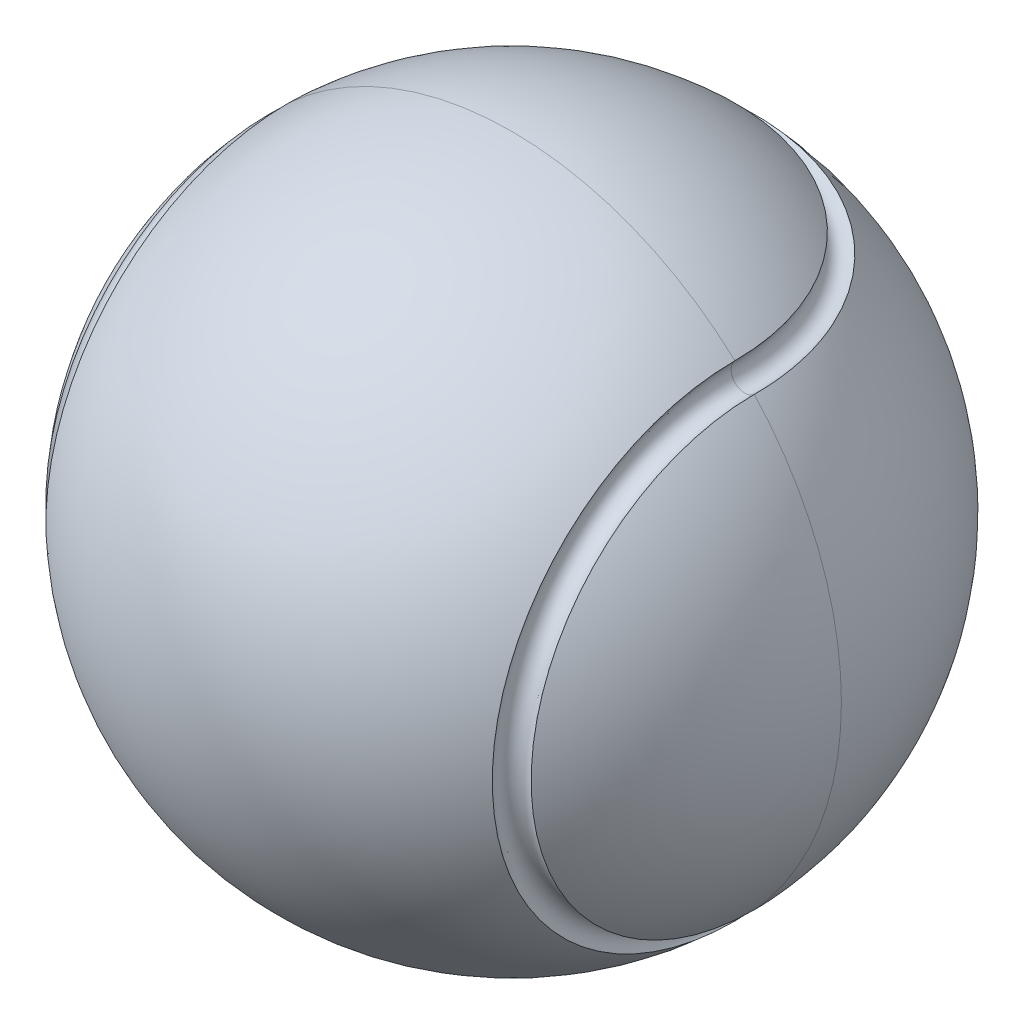
ISO-10303-21;
HEADER;
FILE_DESCRIPTION(('STEP AP214'),'2;1');
FILE_NAME('part.step','',(''),(''),'','','');
FILE_SCHEMA(('AUTOMOTIVE_DESIGN { 1 0 10303 214 1 1 1 1 }'));
ENDSEC;
DATA;
#1=APPLICATION_CONTEXT('core data for automotive mechanical design processes');
#2=APPLICATION_PROTOCOL_DEFINITION('international standard','automotive_design',2000,#1);
#3=PRODUCT_CONTEXT('',#1,'mechanical');
#4=PRODUCT('Part','Part','',(#3));
#5=PRODUCT_RELATED_PRODUCT_CATEGORY('part','',(#4));
#6=PRODUCT_DEFINITION_FORMATION('','',#4);
#7=PRODUCT_DEFINITION_CONTEXT('part definition',#1,'design');
#8=PRODUCT_DEFINITION('design','',#6,#7);
#9=PRODUCT_DEFINITION_SHAPE('','',#8);
#10=(LENGTH_UNIT() NAMED_UNIT(*) SI_UNIT(.MILLI.,.METRE.));
#11=(NAMED_UNIT(*) PLANE_ANGLE_UNIT() SI_UNIT($,.RADIAN.));
#12=(NAMED_UNIT(*) SI_UNIT($,.STERADIAN.) SOLID_ANGLE_UNIT());
#13=UNCERTAINTY_MEASURE_WITH_UNIT(LENGTH_MEASURE(1.E-05),#10,'distance_accuracy_value','');
#14=(GEOMETRIC_REPRESENTATION_CONTEXT(3) GLOBAL_UNCERTAINTY_ASSIGNED_CONTEXT((#13)) GLOBAL_UNIT_ASSIGNED_CONTEXT((#10,
#11,#12)) REPRESENTATION_CONTEXT('',''));
#15=CARTESIAN_POINT('',(0.,0.,0.));
#16=DIRECTION('',(0.,0.,1.));
#17=DIRECTION('',(1.,0.,0.));
#18=AXIS2_PLACEMENT_3D('',#15,#16,#17);
#19=CARTESIAN_POINT('',(-53.8815367264149,0.,0.));
#20=DIRECTION('',(1.,0.,0.));
#21=DIRECTION('',(0.,0.,-1.));
#22=AXIS2_PLACEMENT_3D('',#19,#20,#21);
#23=TOROIDAL_SURFACE('',#22,53.8815367264149,3.175);
#24=CARTESIAN_POINT('',(-56.079341326432,0.,0.));
#25=DIRECTION('',(-1.,0.,0.));
#26=DIRECTION('',(0.,0.,1.));
#27=AXIS2_PLACEMENT_3D('',#24,#25,#26);
#28=CIRCLE('',#27,51.5901877918034);
#29=CARTESIAN_POINT('',(-56.0793413264318,51.5901877918036,0.));
#30=VERTEX_POINT('',#29);
#31=CARTESIAN_POINT('',(-56.0793413264318,-51.5901877918036,0.));
#32=VERTEX_POINT('',#31);
#33=EDGE_CURVE('E12',#30,#32,#28,.F.);
#34=ORIENTED_EDGE('',*,*,#33,.T.);
#35=CARTESIAN_POINT('',(-53.8815367264149,-53.8815367264149,0.));
#36=DIRECTION('',(0.,0.,1.));
#37=DIRECTION('',(-1.,0.,0.));
#38=AXIS2_PLACEMENT_3D('',#35,#36,#37);
#39=CIRCLE('',#38,3.175);
#40=CARTESIAN_POINT('',(-51.5901877918036,-56.0793413264319,0.));
#41=VERTEX_POINT('',#40);
#42=EDGE_CURVE('E105',#41,#32,#39,.T.);
#43=ORIENTED_EDGE('',*,*,#42,.F.);
#44=CARTESIAN_POINT('',(-51.5901877918033,0.,0.));
#45=DIRECTION('',(1.,0.,0.));
#46=DIRECTION('',(0.,0.,-1.));
#47=AXIS2_PLACEMENT_3D('',#44,#45,#46);
#48=CIRCLE('',#47,56.0793413264321);
#49=CARTESIAN_POINT('',(-51.5901877918036,56.0793413264319,0.));
#50=VERTEX_POINT('',#49);
#51=EDGE_CURVE('E69',#41,#50,#48,.F.);
#52=ORIENTED_EDGE('',*,*,#51,.T.);
#53=CARTESIAN_POINT('',(-53.8815367264149,53.8815367264149,0.));
#54=DIRECTION('',(0.,0.,-1.));
#55=DIRECTION('',(-1.,0.,0.));
#56=AXIS2_PLACEMENT_3D('',#53,#54,#55);
#57=CIRCLE('',#56,3.175);
#58=EDGE_CURVE('E102',#50,#30,#57,.T.);
#59=ORIENTED_EDGE('',*,*,#58,.T.);
#60=EDGE_LOOP('',(#34,#43,#52,#59));
#61=FACE_BOUND('',#60,.T.);
#62=ADVANCED_FACE('F61',(#61),#23,.F.);
#63=CARTESIAN_POINT('',(0.,-53.8815367264149,0.));
#64=DIRECTION('',(0.,-1.,0.));
#65=DIRECTION('',(0.,0.,-1.));
#66=AXIS2_PLACEMENT_3D('',#63,#64,#65);
#67=TOROIDAL_SURFACE('',#66,53.8815367264149,3.175);
#68=CARTESIAN_POINT('',(0.,-51.5901877918036,0.));
#69=DIRECTION('',(0.,1.,0.));
#70=DIRECTION('',(0.,0.,1.));
#71=AXIS2_PLACEMENT_3D('',#68,#69,#70);
#72=CIRCLE('',#71,56.0793413264318);
#73=CARTESIAN_POINT('',(56.079341326432,-51.5901877918034,0.));
#74=VERTEX_POINT('',#73);
#75=EDGE_CURVE('E137',#32,#74,#72,.F.);
#76=ORIENTED_EDGE('',*,*,#75,.T.);
#77=CARTESIAN_POINT('',(53.8815367264149,-53.8815367264149,0.));
#78=DIRECTION('',(0.,0.,-1.));
#79=DIRECTION('',(1.,0.,0.));
#80=AXIS2_PLACEMENT_3D('',#77,#78,#79);
#81=CIRCLE('',#80,3.175);
#82=CARTESIAN_POINT('',(51.5901877918033,-56.0793413264318,0.));
#83=VERTEX_POINT('',#82);
#84=EDGE_CURVE('E81',#83,#74,#81,.T.);
#85=ORIENTED_EDGE('',*,*,#84,.F.);
#86=CARTESIAN_POINT('',(0.,-56.0793413264319,0.));
#87=DIRECTION('',(0.,-1.,0.));
#88=DIRECTION('',(0.,0.,-1.));
#89=AXIS2_PLACEMENT_3D('',#86,#87,#88);
#90=CIRCLE('',#89,51.5901877918035);
#91=EDGE_CURVE('E150',#83,#41,#90,.F.);
#92=ORIENTED_EDGE('',*,*,#91,.T.);
#93=ORIENTED_EDGE('',*,*,#42,.T.);
#94=EDGE_LOOP('',(#76,#85,#92,#93));
#95=FACE_BOUND('',#94,.T.);
#96=ADVANCED_FACE('F163',(#95),#67,.F.);
#97=CARTESIAN_POINT('',(53.8815367264149,0.,0.));
#98=DIRECTION('',(-1.,0.,0.));
#99=DIRECTION('',(0.,0.,1.));
#100=AXIS2_PLACEMENT_3D('',#97,#98,#99);
#101=TOROIDAL_SURFACE('',#100,53.8815367264149,3.175);
#102=CARTESIAN_POINT('',(56.079341326432,0.,0.));
#103=DIRECTION('',(1.,0.,0.));
#104=DIRECTION('',(0.,0.,-1.));
#105=AXIS2_PLACEMENT_3D('',#102,#103,#104);
#106=CIRCLE('',#105,51.5901877918034);
#107=CARTESIAN_POINT('',(56.0793413264318,51.5901877918036,0.));
#108=VERTEX_POINT('',#107);
#109=EDGE_CURVE('E110',#74,#108,#106,.F.);
#110=ORIENTED_EDGE('',*,*,#109,.T.);
#111=CARTESIAN_POINT('',(53.8815367264149,53.8815367264149,0.));
#112=DIRECTION('',(0.,0.,1.));
#113=DIRECTION('',(1.,0.,0.));
#114=AXIS2_PLACEMENT_3D('',#111,#112,#113);
#115=CIRCLE('',#114,3.175);
#116=CARTESIAN_POINT('',(51.5901877918035,56.0793413264319,0.));
#117=VERTEX_POINT('',#116);
#118=EDGE_CURVE('E76',#117,#108,#115,.T.);
#119=ORIENTED_EDGE('',*,*,#118,.F.);
#120=CARTESIAN_POINT('',(51.5901877918033,0.,0.));
#121=DIRECTION('',(-1.,0.,0.));
#122=DIRECTION('',(0.,0.,1.));
#123=AXIS2_PLACEMENT_3D('',#120,#121,#122);
#124=CIRCLE('',#123,56.0793413264321);
#125=EDGE_CURVE('E125',#117,#83,#124,.F.);
#126=ORIENTED_EDGE('',*,*,#125,.T.);
#127=ORIENTED_EDGE('',*,*,#84,.T.);
#128=EDGE_LOOP('',(#110,#119,#126,#127));
#129=FACE_BOUND('',#128,.T.);
#130=ADVANCED_FACE('F143',(#129),#101,.F.);
#131=CARTESIAN_POINT('',(0.,53.8815367264149,0.));
#132=DIRECTION('',(0.,1.,0.));
#133=DIRECTION('',(0.,0.,1.));
#134=AXIS2_PLACEMENT_3D('',#131,#132,#133);
#135=TOROIDAL_SURFACE('',#134,53.8815367264149,3.175);
#136=CARTESIAN_POINT('',(0.,51.5901877918036,0.));
#137=DIRECTION('',(0.,-1.,0.));
#138=DIRECTION('',(0.,0.,-1.));
#139=AXIS2_PLACEMENT_3D('',#136,#137,#138);
#140=CIRCLE('',#139,56.0793413264318);
#141=EDGE_CURVE('E117',#108,#30,#140,.F.);
#142=ORIENTED_EDGE('',*,*,#141,.T.);
#143=ORIENTED_EDGE('',*,*,#58,.F.);
#144=CARTESIAN_POINT('',(0.,56.0793413264319,0.));
#145=DIRECTION('',(0.,1.,0.));
#146=DIRECTION('',(0.,0.,1.));
#147=AXIS2_PLACEMENT_3D('',#144,#145,#146);
#148=CIRCLE('',#147,51.5901877918035);
#149=EDGE_CURVE('E114',#50,#117,#148,.F.);
#150=ORIENTED_EDGE('',*,*,#149,.T.);
#151=ORIENTED_EDGE('',*,*,#118,.T.);
#152=EDGE_LOOP('',(#142,#143,#150,#151));
#153=FACE_BOUND('',#152,.T.);
#154=ADVANCED_FACE('F113',(#153),#135,.F.);
#155=CARTESIAN_POINT('',(0.,0.,0.));
#156=DIRECTION('',(-1.,0.,0.));
#157=DIRECTION('',(0.,1.,0.));
#158=AXIS2_PLACEMENT_3D('',#155,#156,#157);
#159=SPHERICAL_SURFACE('',#158,76.2);
#160=ORIENTED_EDGE('',*,*,#51,.F.);
#161=CARTESIAN_POINT('',(0.,0.,0.));
#162=DIRECTION('',(0.,0.,-1.));
#163=DIRECTION('',(-1.,0.,0.));
#164=AXIS2_PLACEMENT_3D('',#161,#162,#163);
#165=CIRCLE('',#164,76.2);
#166=EDGE_CURVE('E135',#41,#83,#165,.F.);
#167=ORIENTED_EDGE('',*,*,#166,.T.);
#168=ORIENTED_EDGE('',*,*,#125,.F.);
#169=EDGE_CURVE('E122',#117,#50,#165,.F.);
#170=ORIENTED_EDGE('',*,*,#169,.T.);
#171=EDGE_LOOP('',(#160,#167,#168,#170));
#172=FACE_BOUND('',#171,.T.);
#173=ADVANCED_FACE('F124',(#172),#159,.T.);
#174=ORIENTED_EDGE('',*,*,#149,.F.);
#175=ORIENTED_EDGE('',*,*,#169,.F.);
#176=EDGE_LOOP('',(#174,#175));
#177=FACE_BOUND('',#176,.T.);
#178=ADVANCED_FACE('F121',(#177),#159,.T.);
#179=ORIENTED_EDGE('',*,*,#91,.F.);
#180=ORIENTED_EDGE('',*,*,#166,.F.);
#181=EDGE_LOOP('',(#179,#180));
#182=FACE_BOUND('',#181,.T.);
#183=ADVANCED_FACE('F160',(#182),#159,.T.);
#184=ORIENTED_EDGE('',*,*,#75,.F.);
#185=EDGE_CURVE('E128',#30,#32,#165,.F.);
#186=ORIENTED_EDGE('',*,*,#185,.F.);
#187=ORIENTED_EDGE('',*,*,#141,.F.);
#188=EDGE_CURVE('E127',#74,#108,#165,.F.);
#189=ORIENTED_EDGE('',*,*,#188,.F.);
#190=EDGE_LOOP('',(#184,#186,#187,#189));
#191=FACE_BOUND('',#190,.T.);
#192=ADVANCED_FACE('F63',(#191),#159,.T.);
#193=ORIENTED_EDGE('',*,*,#33,.F.);
#194=ORIENTED_EDGE('',*,*,#185,.T.);
#195=EDGE_LOOP('',(#193,#194));
#196=FACE_BOUND('',#195,.T.);
#197=ADVANCED_FACE('F154',(#196),#159,.T.);
#198=ORIENTED_EDGE('',*,*,#109,.F.);
#199=ORIENTED_EDGE('',*,*,#188,.T.);
#200=EDGE_LOOP('',(#198,#199));
#201=FACE_BOUND('',#200,.T.);
#202=ADVANCED_FACE('F152',(#201),#159,.T.);
#203=CLOSED_SHELL('',(#62,#96,#130,#154,#173,#178,#183,#192,#197,#202));
#204=MANIFOLD_SOLID_BREP('B2',#203);
#205=ADVANCED_BREP_SHAPE_REPRESENTATION('',(#18,#204),#14);
#206=SHAPE_DEFINITION_REPRESENTATION(#9,#205);
ENDSEC;
END-ISO-10303-21;
